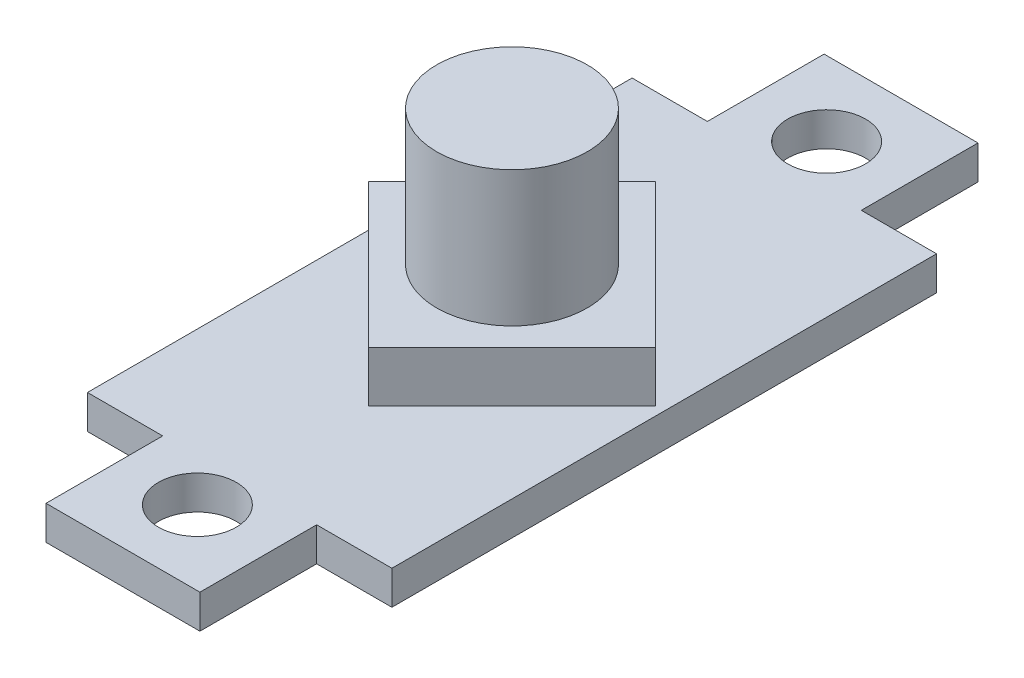
ISO-10303-21;
HEADER;
FILE_DESCRIPTION(('STEP AP214'),'2;1');
FILE_NAME('part.step','',(''),(''),'','','');
FILE_SCHEMA(('AUTOMOTIVE_DESIGN { 1 0 10303 214 1 1 1 1 }'));
ENDSEC;
DATA;
#1=APPLICATION_CONTEXT('core data for automotive mechanical design processes');
#2=APPLICATION_PROTOCOL_DEFINITION('international standard','automotive_design',2000,#1);
#3=PRODUCT_CONTEXT('',#1,'mechanical');
#4=PRODUCT('Part','Part','',(#3));
#5=PRODUCT_RELATED_PRODUCT_CATEGORY('part','',(#4));
#6=PRODUCT_DEFINITION_FORMATION('','',#4);
#7=PRODUCT_DEFINITION_CONTEXT('part definition',#1,'design');
#8=PRODUCT_DEFINITION('design','',#6,#7);
#9=PRODUCT_DEFINITION_SHAPE('','',#8);
#10=(LENGTH_UNIT() NAMED_UNIT(*) SI_UNIT(.MILLI.,.METRE.));
#11=(NAMED_UNIT(*) PLANE_ANGLE_UNIT() SI_UNIT($,.RADIAN.));
#12=(NAMED_UNIT(*) SI_UNIT($,.STERADIAN.) SOLID_ANGLE_UNIT());
#13=UNCERTAINTY_MEASURE_WITH_UNIT(LENGTH_MEASURE(1.E-05),#10,'distance_accuracy_value','');
#14=(GEOMETRIC_REPRESENTATION_CONTEXT(3) GLOBAL_UNCERTAINTY_ASSIGNED_CONTEXT((#13)) GLOBAL_UNIT_ASSIGNED_CONTEXT((#10,
#11,#12)) REPRESENTATION_CONTEXT('',''));
#15=CARTESIAN_POINT('',(0.,0.,0.));
#16=DIRECTION('',(0.,0.,1.));
#17=DIRECTION('',(1.,0.,0.));
#18=AXIS2_PLACEMENT_3D('',#15,#16,#17);
#19=CARTESIAN_POINT('',(0.,2.5,0.));
#20=DIRECTION('',(0.,1.,0.));
#21=DIRECTION('',(0.,0.,1.));
#22=AXIS2_PLACEMENT_3D('',#19,#20,#21);
#23=PLANE('',#22);
#24=DIRECTION('',(0.707106781186548,0.,0.707106781186547));
#25=VECTOR('',#24,1.);
#26=CARTESIAN_POINT('',(-4.24264068711929,2.5,0.));
#27=LINE('',#26,#25);
#28=CARTESIAN_POINT('',(-4.24264068711929,2.5,0.));
#29=VERTEX_POINT('',#28);
#30=CARTESIAN_POINT('',(0.,2.5,4.24264068711929));
#31=VERTEX_POINT('',#30);
#32=EDGE_CURVE('E279',#29,#31,#27,.T.);
#33=ORIENTED_EDGE('',*,*,#32,.T.);
#34=DIRECTION('',(0.707106781186547,0.,-0.707106781186548));
#35=VECTOR('',#34,1.);
#36=CARTESIAN_POINT('',(0.,2.5,4.24264068711929));
#37=LINE('',#36,#35);
#38=CARTESIAN_POINT('',(4.24264068711928,2.5,0.));
#39=VERTEX_POINT('',#38);
#40=EDGE_CURVE('E294',#31,#39,#37,.T.);
#41=ORIENTED_EDGE('',*,*,#40,.T.);
#42=DIRECTION('',(-0.707106781186547,0.,-0.707106781186548));
#43=VECTOR('',#42,1.);
#44=CARTESIAN_POINT('',(4.24264068711928,2.5,0.));
#45=LINE('',#44,#43);
#46=CARTESIAN_POINT('',(0.,2.5,-4.24264068711928));
#47=VERTEX_POINT('',#46);
#48=EDGE_CURVE('E291',#39,#47,#45,.T.);
#49=ORIENTED_EDGE('',*,*,#48,.T.);
#50=DIRECTION('',(-0.707106781186548,0.,0.707106781186547));
#51=VECTOR('',#50,1.);
#52=CARTESIAN_POINT('',(0.,2.5,-4.24264068711928));
#53=LINE('',#52,#51);
#54=EDGE_CURVE('E276',#47,#29,#53,.T.);
#55=ORIENTED_EDGE('',*,*,#54,.T.);
#56=EDGE_LOOP('',(#33,#41,#49,#55));
#57=FACE_BOUND('',#56,.T.);
#58=CARTESIAN_POINT('',(0.,2.5,0.));
#59=DIRECTION('',(0.,1.,0.));
#60=DIRECTION('',(0.,0.,1.));
#61=AXIS2_PLACEMENT_3D('',#58,#59,#60);
#62=CIRCLE('',#61,2.22664019701576);
#63=CARTESIAN_POINT('',(0.,2.5,2.22664019701576));
#64=VERTEX_POINT('',#63);
#65=EDGE_CURVE('E299',#64,#64,#62,.T.);
#66=ORIENTED_EDGE('',*,*,#65,.F.);
#67=EDGE_LOOP('',(#66));
#68=FACE_BOUND('',#67,.T.);
#69=ADVANCED_FACE('F32',(#57,#68),#23,.T.);
#70=CARTESIAN_POINT('',(0.,1.,0.));
#71=DIRECTION('',(0.,1.,0.));
#72=DIRECTION('',(0.,0.,1.));
#73=AXIS2_PLACEMENT_3D('',#70,#71,#72);
#74=PLANE('',#73);
#75=CARTESIAN_POINT('',(0.,1.,9.3));
#76=DIRECTION('',(0.,1.,0.));
#77=DIRECTION('',(0.,0.,1.));
#78=AXIS2_PLACEMENT_3D('',#75,#76,#77);
#79=CIRCLE('',#78,1.15);
#80=CARTESIAN_POINT('',(0.,1.,10.45));
#81=VERTEX_POINT('',#80);
#82=EDGE_CURVE('E166',#81,#81,#79,.F.);
#83=ORIENTED_EDGE('',*,*,#82,.T.);
#84=EDGE_LOOP('',(#83));
#85=FACE_BOUND('',#84,.T.);
#86=CARTESIAN_POINT('',(0.,1.,-9.3));
#87=DIRECTION('',(0.,1.,0.));
#88=DIRECTION('',(0.,0.,1.));
#89=AXIS2_PLACEMENT_3D('',#86,#87,#88);
#90=CIRCLE('',#89,1.15);
#91=CARTESIAN_POINT('',(0.,1.,-8.15));
#92=VERTEX_POINT('',#91);
#93=EDGE_CURVE('E160',#92,#92,#90,.T.);
#94=ORIENTED_EDGE('',*,*,#93,.F.);
#95=EDGE_LOOP('',(#94));
#96=FACE_BOUND('',#95,.T.);
#97=DIRECTION('',(-1.,0.,0.));
#98=VECTOR('',#97,1.);
#99=CARTESIAN_POINT('',(0.,1.,8.05));
#100=LINE('',#99,#98);
#101=CARTESIAN_POINT('',(-2.275,1.,8.05));
#102=VERTEX_POINT('',#101);
#103=CARTESIAN_POINT('',(-4.5,1.,8.05));
#104=VERTEX_POINT('',#103);
#105=EDGE_CURVE('E207',#102,#104,#100,.T.);
#106=ORIENTED_EDGE('',*,*,#105,.F.);
#107=DIRECTION('',(0.,0.,1.));
#108=VECTOR('',#107,1.);
#109=CARTESIAN_POINT('',(-2.275,1.,0.));
#110=LINE('',#109,#108);
#111=CARTESIAN_POINT('',(-2.275,1.,11.5));
#112=VERTEX_POINT('',#111);
#113=EDGE_CURVE('E248',#102,#112,#110,.T.);
#114=ORIENTED_EDGE('',*,*,#113,.T.);
#115=DIRECTION('',(1.,0.,0.));
#116=VECTOR('',#115,1.);
#117=CARTESIAN_POINT('',(0.,1.,11.5));
#118=LINE('',#117,#116);
#119=CARTESIAN_POINT('',(2.275,1.,11.5));
#120=VERTEX_POINT('',#119);
#121=EDGE_CURVE('E229',#112,#120,#118,.T.);
#122=ORIENTED_EDGE('',*,*,#121,.T.);
#123=DIRECTION('',(0.,0.,1.));
#124=VECTOR('',#123,1.);
#125=CARTESIAN_POINT('',(2.275,1.,0.));
#126=LINE('',#125,#124);
#127=CARTESIAN_POINT('',(2.275,1.,8.05));
#128=VERTEX_POINT('',#127);
#129=EDGE_CURVE('E241',#128,#120,#126,.T.);
#130=ORIENTED_EDGE('',*,*,#129,.F.);
#131=DIRECTION('',(-1.,0.,0.));
#132=VECTOR('',#131,1.);
#133=CARTESIAN_POINT('',(0.,1.,8.05));
#134=LINE('',#133,#132);
#135=CARTESIAN_POINT('',(4.5,1.,8.05));
#136=VERTEX_POINT('',#135);
#137=EDGE_CURVE('E244',#136,#128,#134,.T.);
#138=ORIENTED_EDGE('',*,*,#137,.F.);
#139=DIRECTION('',(0.,0.,1.));
#140=VECTOR('',#139,1.);
#141=CARTESIAN_POINT('',(4.5,1.,0.));
#142=LINE('',#141,#140);
#143=CARTESIAN_POINT('',(4.5,1.,-8.05));
#144=VERTEX_POINT('',#143);
#145=EDGE_CURVE('E246',#144,#136,#142,.T.);
#146=ORIENTED_EDGE('',*,*,#145,.F.);
#147=DIRECTION('',(-1.,0.,0.));
#148=VECTOR('',#147,1.);
#149=CARTESIAN_POINT('',(0.,1.,-8.05));
#150=LINE('',#149,#148);
#151=CARTESIAN_POINT('',(2.275,1.,-8.05));
#152=VERTEX_POINT('',#151);
#153=EDGE_CURVE('E254',#144,#152,#150,.T.);
#154=ORIENTED_EDGE('',*,*,#153,.T.);
#155=DIRECTION('',(0.,0.,1.));
#156=VECTOR('',#155,1.);
#157=CARTESIAN_POINT('',(2.275,1.,0.));
#158=LINE('',#157,#156);
#159=CARTESIAN_POINT('',(2.275,1.,-11.5));
#160=VERTEX_POINT('',#159);
#161=EDGE_CURVE('E256',#160,#152,#158,.T.);
#162=ORIENTED_EDGE('',*,*,#161,.F.);
#163=DIRECTION('',(1.,0.,0.));
#164=VECTOR('',#163,1.);
#165=CARTESIAN_POINT('',(0.,1.,-11.5));
#166=LINE('',#165,#164);
#167=CARTESIAN_POINT('',(-2.275,1.,-11.5));
#168=VERTEX_POINT('',#167);
#169=EDGE_CURVE('E144',#168,#160,#166,.T.);
#170=ORIENTED_EDGE('',*,*,#169,.F.);
#171=DIRECTION('',(0.,0.,1.));
#172=VECTOR('',#171,1.);
#173=CARTESIAN_POINT('',(-2.275,1.,0.));
#174=LINE('',#173,#172);
#175=CARTESIAN_POINT('',(-2.275,1.,-8.05));
#176=VERTEX_POINT('',#175);
#177=EDGE_CURVE('E135',#168,#176,#174,.T.);
#178=ORIENTED_EDGE('',*,*,#177,.T.);
#179=DIRECTION('',(-1.,0.,0.));
#180=VECTOR('',#179,1.);
#181=CARTESIAN_POINT('',(0.,1.,-8.05));
#182=LINE('',#181,#180);
#183=CARTESIAN_POINT('',(-4.5,1.,-8.05));
#184=VERTEX_POINT('',#183);
#185=EDGE_CURVE('E140',#176,#184,#182,.T.);
#186=ORIENTED_EDGE('',*,*,#185,.T.);
#187=DIRECTION('',(0.,0.,1.));
#188=VECTOR('',#187,1.);
#189=CARTESIAN_POINT('',(-4.5,1.,0.));
#190=LINE('',#189,#188);
#191=EDGE_CURVE('E56',#184,#104,#190,.T.);
#192=ORIENTED_EDGE('',*,*,#191,.T.);
#193=EDGE_LOOP('',(#106,#114,#122,#130,#138,#146,#154,#162,#170,#178,#186,#192));
#194=FACE_BOUND('',#193,.T.);
#195=DIRECTION('',(0.707106781186547,0.,-0.707106781186548));
#196=VECTOR('',#195,1.);
#197=CARTESIAN_POINT('',(0.,1.,4.24264068711929));
#198=LINE('',#197,#196);
#199=CARTESIAN_POINT('',(0.,1.,4.24264068711929));
#200=VERTEX_POINT('',#199);
#201=CARTESIAN_POINT('',(4.24264068711928,1.,0.));
#202=VERTEX_POINT('',#201);
#203=EDGE_CURVE('E282',#200,#202,#198,.T.);
#204=ORIENTED_EDGE('',*,*,#203,.F.);
#205=DIRECTION('',(0.707106781186548,0.,0.707106781186547));
#206=VECTOR('',#205,1.);
#207=CARTESIAN_POINT('',(-4.24264068711929,1.,0.));
#208=LINE('',#207,#206);
#209=CARTESIAN_POINT('',(-4.24264068711929,1.,0.));
#210=VERTEX_POINT('',#209);
#211=EDGE_CURVE('E285',#210,#200,#208,.T.);
#212=ORIENTED_EDGE('',*,*,#211,.F.);
#213=DIRECTION('',(-0.707106781186548,0.,0.707106781186547));
#214=VECTOR('',#213,1.);
#215=CARTESIAN_POINT('',(0.,1.,-4.24264068711928));
#216=LINE('',#215,#214);
#217=CARTESIAN_POINT('',(0.,1.,-4.24264068711928));
#218=VERTEX_POINT('',#217);
#219=EDGE_CURVE('E277',#218,#210,#216,.T.);
#220=ORIENTED_EDGE('',*,*,#219,.F.);
#221=DIRECTION('',(-0.707106781186547,0.,-0.707106781186548));
#222=VECTOR('',#221,1.);
#223=CARTESIAN_POINT('',(4.24264068711928,1.,0.));
#224=LINE('',#223,#222);
#225=EDGE_CURVE('E280',#202,#218,#224,.T.);
#226=ORIENTED_EDGE('',*,*,#225,.F.);
#227=EDGE_LOOP('',(#204,#212,#220,#226));
#228=FACE_BOUND('',#227,.T.);
#229=ADVANCED_FACE('F137',(#85,#96,#194,#228),#74,.T.);
#230=CARTESIAN_POINT('',(0.,1.,8.05));
#231=DIRECTION('',(0.,0.,1.));
#232=DIRECTION('',(1.,0.,0.));
#233=AXIS2_PLACEMENT_3D('',#230,#231,#232);
#234=PLANE('',#233);
#235=DIRECTION('',(-1.,0.,0.));
#236=VECTOR('',#235,1.);
#237=CARTESIAN_POINT('',(0.,0.,8.05));
#238=LINE('',#237,#236);
#239=CARTESIAN_POINT('',(-2.275,0.,8.05));
#240=VERTEX_POINT('',#239);
#241=CARTESIAN_POINT('',(-4.5,0.,8.05));
#242=VERTEX_POINT('',#241);
#243=EDGE_CURVE('E169',#240,#242,#238,.T.);
#244=ORIENTED_EDGE('',*,*,#243,.F.);
#245=DIRECTION('',(0.,-1.,0.));
#246=VECTOR('',#245,1.);
#247=CARTESIAN_POINT('',(-2.275,1.,8.05));
#248=LINE('',#247,#246);
#249=EDGE_CURVE('E11',#102,#240,#248,.T.);
#250=ORIENTED_EDGE('',*,*,#249,.F.);
#251=ORIENTED_EDGE('',*,*,#105,.T.);
#252=DIRECTION('',(0.,-1.,0.));
#253=VECTOR('',#252,1.);
#254=CARTESIAN_POINT('',(-4.5,1.,8.05));
#255=LINE('',#254,#253);
#256=EDGE_CURVE('E100',#104,#242,#255,.T.);
#257=ORIENTED_EDGE('',*,*,#256,.T.);
#258=EDGE_LOOP('',(#244,#250,#251,#257));
#259=FACE_BOUND('',#258,.T.);
#260=ADVANCED_FACE('F34',(#259),#234,.T.);
#261=CARTESIAN_POINT('',(-2.275,1.,0.));
#262=DIRECTION('',(1.,0.,0.));
#263=DIRECTION('',(0.,0.,-1.));
#264=AXIS2_PLACEMENT_3D('',#261,#262,#263);
#265=PLANE('',#264);
#266=DIRECTION('',(0.,0.,1.));
#267=VECTOR('',#266,1.);
#268=CARTESIAN_POINT('',(-2.275,0.,0.));
#269=LINE('',#268,#267);
#270=CARTESIAN_POINT('',(-2.275,0.,11.5));
#271=VERTEX_POINT('',#270);
#272=EDGE_CURVE('E172',#240,#271,#269,.T.);
#273=ORIENTED_EDGE('',*,*,#272,.T.);
#274=DIRECTION('',(0.,-1.,0.));
#275=VECTOR('',#274,1.);
#276=CARTESIAN_POINT('',(-2.275,1.,11.5));
#277=LINE('',#276,#275);
#278=EDGE_CURVE('E40',#112,#271,#277,.T.);
#279=ORIENTED_EDGE('',*,*,#278,.F.);
#280=ORIENTED_EDGE('',*,*,#113,.F.);
#281=ORIENTED_EDGE('',*,*,#249,.T.);
#282=EDGE_LOOP('',(#273,#279,#280,#281));
#283=FACE_BOUND('',#282,.T.);
#284=ADVANCED_FACE('F375',(#283),#265,.F.);
#285=CARTESIAN_POINT('',(0.,1.,11.5));
#286=DIRECTION('',(0.,0.,-1.));
#287=DIRECTION('',(-1.,0.,0.));
#288=AXIS2_PLACEMENT_3D('',#285,#286,#287);
#289=PLANE('',#288);
#290=DIRECTION('',(1.,0.,0.));
#291=VECTOR('',#290,1.);
#292=CARTESIAN_POINT('',(0.,0.,11.5));
#293=LINE('',#292,#291);
#294=CARTESIAN_POINT('',(2.275,0.,11.5));
#295=VERTEX_POINT('',#294);
#296=EDGE_CURVE('E175',#271,#295,#293,.T.);
#297=ORIENTED_EDGE('',*,*,#296,.T.);
#298=DIRECTION('',(0.,-1.,0.));
#299=VECTOR('',#298,1.);
#300=CARTESIAN_POINT('',(2.275,1.,11.5));
#301=LINE('',#300,#299);
#302=EDGE_CURVE('E221',#120,#295,#301,.T.);
#303=ORIENTED_EDGE('',*,*,#302,.F.);
#304=ORIENTED_EDGE('',*,*,#121,.F.);
#305=ORIENTED_EDGE('',*,*,#278,.T.);
#306=EDGE_LOOP('',(#297,#303,#304,#305));
#307=FACE_BOUND('',#306,.T.);
#308=ADVANCED_FACE('F227',(#307),#289,.F.);
#309=CARTESIAN_POINT('',(2.275,1.,0.));
#310=DIRECTION('',(1.,0.,0.));
#311=DIRECTION('',(0.,0.,-1.));
#312=AXIS2_PLACEMENT_3D('',#309,#310,#311);
#313=PLANE('',#312);
#314=DIRECTION('',(0.,0.,1.));
#315=VECTOR('',#314,1.);
#316=CARTESIAN_POINT('',(2.275,0.,0.));
#317=LINE('',#316,#315);
#318=CARTESIAN_POINT('',(2.275,0.,8.05));
#319=VERTEX_POINT('',#318);
#320=EDGE_CURVE('E178',#319,#295,#317,.T.);
#321=ORIENTED_EDGE('',*,*,#320,.F.);
#322=DIRECTION('',(0.,-1.,0.));
#323=VECTOR('',#322,1.);
#324=CARTESIAN_POINT('',(2.275,1.,8.05));
#325=LINE('',#324,#323);
#326=EDGE_CURVE('E219',#128,#319,#325,.T.);
#327=ORIENTED_EDGE('',*,*,#326,.F.);
#328=ORIENTED_EDGE('',*,*,#129,.T.);
#329=ORIENTED_EDGE('',*,*,#302,.T.);
#330=EDGE_LOOP('',(#321,#327,#328,#329));
#331=FACE_BOUND('',#330,.T.);
#332=ADVANCED_FACE('F238',(#331),#313,.T.);
#333=CARTESIAN_POINT('',(0.,1.,8.05));
#334=DIRECTION('',(0.,0.,1.));
#335=DIRECTION('',(1.,0.,0.));
#336=AXIS2_PLACEMENT_3D('',#333,#334,#335);
#337=PLANE('',#336);
#338=DIRECTION('',(-1.,0.,0.));
#339=VECTOR('',#338,1.);
#340=CARTESIAN_POINT('',(0.,0.,8.05));
#341=LINE('',#340,#339);
#342=CARTESIAN_POINT('',(4.5,0.,8.05));
#343=VERTEX_POINT('',#342);
#344=EDGE_CURVE('E181',#343,#319,#341,.T.);
#345=ORIENTED_EDGE('',*,*,#344,.F.);
#346=DIRECTION('',(0.,-1.,0.));
#347=VECTOR('',#346,1.);
#348=CARTESIAN_POINT('',(4.5,1.,8.05));
#349=LINE('',#348,#347);
#350=EDGE_CURVE('E217',#136,#343,#349,.T.);
#351=ORIENTED_EDGE('',*,*,#350,.F.);
#352=ORIENTED_EDGE('',*,*,#137,.T.);
#353=ORIENTED_EDGE('',*,*,#326,.T.);
#354=EDGE_LOOP('',(#345,#351,#352,#353));
#355=FACE_BOUND('',#354,.T.);
#356=ADVANCED_FACE('F367',(#355),#337,.T.);
#357=CARTESIAN_POINT('',(4.5,1.,0.));
#358=DIRECTION('',(1.,0.,0.));
#359=DIRECTION('',(0.,0.,-1.));
#360=AXIS2_PLACEMENT_3D('',#357,#358,#359);
#361=PLANE('',#360);
#362=DIRECTION('',(0.,0.,1.));
#363=VECTOR('',#362,1.);
#364=CARTESIAN_POINT('',(4.5,0.,0.));
#365=LINE('',#364,#363);
#366=CARTESIAN_POINT('',(4.5,0.,-8.05));
#367=VERTEX_POINT('',#366);
#368=EDGE_CURVE('E184',#367,#343,#365,.T.);
#369=ORIENTED_EDGE('',*,*,#368,.F.);
#370=DIRECTION('',(0.,-1.,0.));
#371=VECTOR('',#370,1.);
#372=CARTESIAN_POINT('',(4.5,1.,-8.05));
#373=LINE('',#372,#371);
#374=EDGE_CURVE('E215',#144,#367,#373,.T.);
#375=ORIENTED_EDGE('',*,*,#374,.F.);
#376=ORIENTED_EDGE('',*,*,#145,.T.);
#377=ORIENTED_EDGE('',*,*,#350,.T.);
#378=EDGE_LOOP('',(#369,#375,#376,#377));
#379=FACE_BOUND('',#378,.T.);
#380=ADVANCED_FACE('F363',(#379),#361,.T.);
#381=CARTESIAN_POINT('',(0.,1.,-8.05));
#382=DIRECTION('',(0.,0.,1.));
#383=DIRECTION('',(1.,0.,0.));
#384=AXIS2_PLACEMENT_3D('',#381,#382,#383);
#385=PLANE('',#384);
#386=DIRECTION('',(-1.,0.,0.));
#387=VECTOR('',#386,1.);
#388=CARTESIAN_POINT('',(0.,0.,-8.05));
#389=LINE('',#388,#387);
#390=CARTESIAN_POINT('',(2.275,0.,-8.05));
#391=VERTEX_POINT('',#390);
#392=EDGE_CURVE('E187',#367,#391,#389,.T.);
#393=ORIENTED_EDGE('',*,*,#392,.T.);
#394=DIRECTION('',(0.,-1.,0.));
#395=VECTOR('',#394,1.);
#396=CARTESIAN_POINT('',(2.275,1.,-8.05));
#397=LINE('',#396,#395);
#398=EDGE_CURVE('E213',#152,#391,#397,.T.);
#399=ORIENTED_EDGE('',*,*,#398,.F.);
#400=ORIENTED_EDGE('',*,*,#153,.F.);
#401=ORIENTED_EDGE('',*,*,#374,.T.);
#402=EDGE_LOOP('',(#393,#399,#400,#401));
#403=FACE_BOUND('',#402,.T.);
#404=ADVANCED_FACE('F359',(#403),#385,.F.);
#405=CARTESIAN_POINT('',(2.275,1.,0.));
#406=DIRECTION('',(1.,0.,0.));
#407=DIRECTION('',(0.,0.,-1.));
#408=AXIS2_PLACEMENT_3D('',#405,#406,#407);
#409=PLANE('',#408);
#410=DIRECTION('',(0.,0.,1.));
#411=VECTOR('',#410,1.);
#412=CARTESIAN_POINT('',(2.275,0.,0.));
#413=LINE('',#412,#411);
#414=CARTESIAN_POINT('',(2.275,0.,-11.5));
#415=VERTEX_POINT('',#414);
#416=EDGE_CURVE('E190',#415,#391,#413,.T.);
#417=ORIENTED_EDGE('',*,*,#416,.F.);
#418=DIRECTION('',(0.,-1.,0.));
#419=VECTOR('',#418,1.);
#420=CARTESIAN_POINT('',(2.275,1.,-11.5));
#421=LINE('',#420,#419);
#422=EDGE_CURVE('E211',#160,#415,#421,.T.);
#423=ORIENTED_EDGE('',*,*,#422,.F.);
#424=ORIENTED_EDGE('',*,*,#161,.T.);
#425=ORIENTED_EDGE('',*,*,#398,.T.);
#426=EDGE_LOOP('',(#417,#423,#424,#425));
#427=FACE_BOUND('',#426,.T.);
#428=ADVANCED_FACE('F356',(#427),#409,.T.);
#429=CARTESIAN_POINT('',(0.,1.,-11.5));
#430=DIRECTION('',(0.,0.,-1.));
#431=DIRECTION('',(-1.,0.,0.));
#432=AXIS2_PLACEMENT_3D('',#429,#430,#431);
#433=PLANE('',#432);
#434=DIRECTION('',(1.,0.,0.));
#435=VECTOR('',#434,1.);
#436=CARTESIAN_POINT('',(0.,0.,-11.5));
#437=LINE('',#436,#435);
#438=CARTESIAN_POINT('',(-2.275,0.,-11.5));
#439=VERTEX_POINT('',#438);
#440=EDGE_CURVE('E193',#439,#415,#437,.T.);
#441=ORIENTED_EDGE('',*,*,#440,.F.);
#442=DIRECTION('',(0.,-1.,0.));
#443=VECTOR('',#442,1.);
#444=CARTESIAN_POINT('',(-2.275,1.,-11.5));
#445=LINE('',#444,#443);
#446=EDGE_CURVE('E154',#168,#439,#445,.T.);
#447=ORIENTED_EDGE('',*,*,#446,.F.);
#448=ORIENTED_EDGE('',*,*,#169,.T.);
#449=ORIENTED_EDGE('',*,*,#422,.T.);
#450=EDGE_LOOP('',(#441,#447,#448,#449));
#451=FACE_BOUND('',#450,.T.);
#452=ADVANCED_FACE('F260',(#451),#433,.T.);
#453=CARTESIAN_POINT('',(-2.275,1.,0.));
#454=DIRECTION('',(1.,0.,0.));
#455=DIRECTION('',(0.,0.,-1.));
#456=AXIS2_PLACEMENT_3D('',#453,#454,#455);
#457=PLANE('',#456);
#458=DIRECTION('',(0.,0.,1.));
#459=VECTOR('',#458,1.);
#460=CARTESIAN_POINT('',(-2.275,0.,0.));
#461=LINE('',#460,#459);
#462=CARTESIAN_POINT('',(-2.275,0.,-8.05));
#463=VERTEX_POINT('',#462);
#464=EDGE_CURVE('E151',#439,#463,#461,.T.);
#465=ORIENTED_EDGE('',*,*,#464,.T.);
#466=DIRECTION('',(0.,-1.,0.));
#467=VECTOR('',#466,1.);
#468=CARTESIAN_POINT('',(-2.275,1.,-8.05));
#469=LINE('',#468,#467);
#470=EDGE_CURVE('E148',#176,#463,#469,.T.);
#471=ORIENTED_EDGE('',*,*,#470,.F.);
#472=ORIENTED_EDGE('',*,*,#177,.F.);
#473=ORIENTED_EDGE('',*,*,#446,.T.);
#474=EDGE_LOOP('',(#465,#471,#472,#473));
#475=FACE_BOUND('',#474,.T.);
#476=ADVANCED_FACE('F149',(#475),#457,.F.);
#477=CARTESIAN_POINT('',(0.,1.,-8.05));
#478=DIRECTION('',(0.,0.,1.));
#479=DIRECTION('',(1.,0.,0.));
#480=AXIS2_PLACEMENT_3D('',#477,#478,#479);
#481=PLANE('',#480);
#482=DIRECTION('',(-1.,0.,0.));
#483=VECTOR('',#482,1.);
#484=CARTESIAN_POINT('',(0.,0.,-8.05));
#485=LINE('',#484,#483);
#486=CARTESIAN_POINT('',(-4.5,0.,-8.05));
#487=VERTEX_POINT('',#486);
#488=EDGE_CURVE('E197',#463,#487,#485,.T.);
#489=ORIENTED_EDGE('',*,*,#488,.T.);
#490=DIRECTION('',(0.,-1.,0.));
#491=VECTOR('',#490,1.);
#492=CARTESIAN_POINT('',(-4.5,1.,-8.05));
#493=LINE('',#492,#491);
#494=EDGE_CURVE('E155',#184,#487,#493,.T.);
#495=ORIENTED_EDGE('',*,*,#494,.F.);
#496=ORIENTED_EDGE('',*,*,#185,.F.);
#497=ORIENTED_EDGE('',*,*,#470,.T.);
#498=EDGE_LOOP('',(#489,#495,#496,#497));
#499=FACE_BOUND('',#498,.T.);
#500=ADVANCED_FACE('F157',(#499),#481,.F.);
#501=CARTESIAN_POINT('',(0.,1.,-9.3));
#502=DIRECTION('',(0.,-1.,0.));
#503=DIRECTION('',(0.,0.,-1.));
#504=AXIS2_PLACEMENT_3D('',#501,#502,#503);
#505=CYLINDRICAL_SURFACE('',#504,1.15);
#506=ORIENTED_EDGE('',*,*,#93,.T.);
#507=EDGE_LOOP('',(#506));
#508=FACE_BOUND('',#507,.T.);
#509=CARTESIAN_POINT('',(0.,0.,-9.3));
#510=DIRECTION('',(0.,1.,0.));
#511=DIRECTION('',(0.,0.,1.));
#512=AXIS2_PLACEMENT_3D('',#509,#510,#511);
#513=CIRCLE('',#512,1.15);
#514=CARTESIAN_POINT('',(0.,0.,-8.15));
#515=VERTEX_POINT('',#514);
#516=EDGE_CURVE('E201',#515,#515,#513,.T.);
#517=ORIENTED_EDGE('',*,*,#516,.F.);
#518=EDGE_LOOP('',(#517));
#519=FACE_BOUND('',#518,.T.);
#520=ADVANCED_FACE('F344',(#508,#519),#505,.F.);
#521=CARTESIAN_POINT('',(-4.5,1.,0.));
#522=DIRECTION('',(1.,0.,0.));
#523=DIRECTION('',(0.,0.,-1.));
#524=AXIS2_PLACEMENT_3D('',#521,#522,#523);
#525=PLANE('',#524);
#526=DIRECTION('',(0.,0.,1.));
#527=VECTOR('',#526,1.);
#528=CARTESIAN_POINT('',(-4.5,0.,0.));
#529=LINE('',#528,#527);
#530=EDGE_CURVE('E199',#487,#242,#529,.T.);
#531=ORIENTED_EDGE('',*,*,#530,.T.);
#532=ORIENTED_EDGE('',*,*,#256,.F.);
#533=ORIENTED_EDGE('',*,*,#191,.F.);
#534=ORIENTED_EDGE('',*,*,#494,.T.);
#535=EDGE_LOOP('',(#531,#532,#533,#534));
#536=FACE_BOUND('',#535,.T.);
#537=ADVANCED_FACE('F264',(#536),#525,.F.);
#538=CARTESIAN_POINT('',(0.,1.,9.3));
#539=DIRECTION('',(0.,-1.,0.));
#540=DIRECTION('',(0.,0.,-1.));
#541=AXIS2_PLACEMENT_3D('',#538,#539,#540);
#542=CYLINDRICAL_SURFACE('',#541,1.15);
#543=ORIENTED_EDGE('',*,*,#82,.F.);
#544=EDGE_LOOP('',(#543));
#545=FACE_BOUND('',#544,.T.);
#546=CARTESIAN_POINT('',(0.,0.,9.3));
#547=DIRECTION('',(0.,1.,0.));
#548=DIRECTION('',(0.,0.,1.));
#549=AXIS2_PLACEMENT_3D('',#546,#547,#548);
#550=CIRCLE('',#549,1.15);
#551=CARTESIAN_POINT('',(0.,0.,10.45));
#552=VERTEX_POINT('',#551);
#553=EDGE_CURVE('E204',#552,#552,#550,.F.);
#554=ORIENTED_EDGE('',*,*,#553,.T.);
#555=EDGE_LOOP('',(#554));
#556=FACE_BOUND('',#555,.T.);
#557=ADVANCED_FACE('F340',(#545,#556),#542,.F.);
#558=CARTESIAN_POINT('',(0.,0.,0.));
#559=DIRECTION('',(0.,1.,0.));
#560=DIRECTION('',(0.,0.,1.));
#561=AXIS2_PLACEMENT_3D('',#558,#559,#560);
#562=PLANE('',#561);
#563=ORIENTED_EDGE('',*,*,#243,.T.);
#564=ORIENTED_EDGE('',*,*,#530,.F.);
#565=ORIENTED_EDGE('',*,*,#488,.F.);
#566=ORIENTED_EDGE('',*,*,#464,.F.);
#567=ORIENTED_EDGE('',*,*,#440,.T.);
#568=ORIENTED_EDGE('',*,*,#416,.T.);
#569=ORIENTED_EDGE('',*,*,#392,.F.);
#570=ORIENTED_EDGE('',*,*,#368,.T.);
#571=ORIENTED_EDGE('',*,*,#344,.T.);
#572=ORIENTED_EDGE('',*,*,#320,.T.);
#573=ORIENTED_EDGE('',*,*,#296,.F.);
#574=ORIENTED_EDGE('',*,*,#272,.F.);
#575=EDGE_LOOP('',(#563,#564,#565,#566,#567,#568,#569,#570,#571,#572,#573,#574));
#576=FACE_BOUND('',#575,.T.);
#577=ORIENTED_EDGE('',*,*,#516,.T.);
#578=EDGE_LOOP('',(#577));
#579=FACE_BOUND('',#578,.T.);
#580=ORIENTED_EDGE('',*,*,#553,.F.);
#581=EDGE_LOOP('',(#580));
#582=FACE_BOUND('',#581,.T.);
#583=ADVANCED_FACE('F233',(#576,#579,#582),#562,.F.);
#584=CARTESIAN_POINT('',(-4.24264068711929,2.5,0.));
#585=DIRECTION('',(0.707106781186547,0.,-0.707106781186548));
#586=DIRECTION('',(-0.707106781186548,0.,-0.707106781186547));
#587=AXIS2_PLACEMENT_3D('',#584,#585,#586);
#588=PLANE('',#587);
#589=ORIENTED_EDGE('',*,*,#211,.T.);
#590=DIRECTION('',(0.,-1.,0.));
#591=VECTOR('',#590,1.);
#592=CARTESIAN_POINT('',(0.,2.5,4.24264068711929));
#593=LINE('',#592,#591);
#594=EDGE_CURVE('E173',#31,#200,#593,.T.);
#595=ORIENTED_EDGE('',*,*,#594,.F.);
#596=ORIENTED_EDGE('',*,*,#32,.F.);
#597=DIRECTION('',(0.,-1.,0.));
#598=VECTOR('',#597,1.);
#599=CARTESIAN_POINT('',(-4.24264068711929,2.5,0.));
#600=LINE('',#599,#598);
#601=EDGE_CURVE('E273',#29,#210,#600,.T.);
#602=ORIENTED_EDGE('',*,*,#601,.T.);
#603=EDGE_LOOP('',(#589,#595,#596,#602));
#604=FACE_BOUND('',#603,.T.);
#605=ADVANCED_FACE('F333',(#604),#588,.F.);
#606=CARTESIAN_POINT('',(0.,2.5,4.24264068711929));
#607=DIRECTION('',(-0.707106781186548,0.,-0.707106781186547));
#608=DIRECTION('',(-0.707106781186547,0.,0.707106781186548));
#609=AXIS2_PLACEMENT_3D('',#606,#607,#608);
#610=PLANE('',#609);
#611=ORIENTED_EDGE('',*,*,#203,.T.);
#612=DIRECTION('',(0.,-1.,0.));
#613=VECTOR('',#612,1.);
#614=CARTESIAN_POINT('',(4.24264068711928,2.5,0.));
#615=LINE('',#614,#613);
#616=EDGE_CURVE('E269',#39,#202,#615,.T.);
#617=ORIENTED_EDGE('',*,*,#616,.F.);
#618=ORIENTED_EDGE('',*,*,#40,.F.);
#619=ORIENTED_EDGE('',*,*,#594,.T.);
#620=EDGE_LOOP('',(#611,#617,#618,#619));
#621=FACE_BOUND('',#620,.T.);
#622=ADVANCED_FACE('F329',(#621),#610,.F.);
#623=CARTESIAN_POINT('',(4.24264068711928,2.5,0.));
#624=DIRECTION('',(-0.707106781186548,0.,0.707106781186547));
#625=DIRECTION('',(0.707106781186547,0.,0.707106781186548));
#626=AXIS2_PLACEMENT_3D('',#623,#624,#625);
#627=PLANE('',#626);
#628=ORIENTED_EDGE('',*,*,#225,.T.);
#629=DIRECTION('',(0.,-1.,0.));
#630=VECTOR('',#629,1.);
#631=CARTESIAN_POINT('',(0.,2.5,-4.24264068711928));
#632=LINE('',#631,#630);
#633=EDGE_CURVE('E47',#47,#218,#632,.T.);
#634=ORIENTED_EDGE('',*,*,#633,.F.);
#635=ORIENTED_EDGE('',*,*,#48,.F.);
#636=ORIENTED_EDGE('',*,*,#616,.T.);
#637=EDGE_LOOP('',(#628,#634,#635,#636));
#638=FACE_BOUND('',#637,.T.);
#639=ADVANCED_FACE('F326',(#638),#627,.F.);
#640=CARTESIAN_POINT('',(0.,2.5,-4.24264068711928));
#641=DIRECTION('',(0.707106781186547,0.,0.707106781186548));
#642=DIRECTION('',(0.707106781186548,0.,-0.707106781186547));
#643=AXIS2_PLACEMENT_3D('',#640,#641,#642);
#644=PLANE('',#643);
#645=ORIENTED_EDGE('',*,*,#219,.T.);
#646=ORIENTED_EDGE('',*,*,#601,.F.);
#647=ORIENTED_EDGE('',*,*,#54,.F.);
#648=ORIENTED_EDGE('',*,*,#633,.T.);
#649=EDGE_LOOP('',(#645,#646,#647,#648));
#650=FACE_BOUND('',#649,.T.);
#651=ADVANCED_FACE('F310',(#650),#644,.F.);
#652=CARTESIAN_POINT('',(0.,6.5,0.));
#653=DIRECTION('',(0.,-1.,0.));
#654=DIRECTION('',(0.,0.,-1.));
#655=AXIS2_PLACEMENT_3D('',#652,#653,#654);
#656=CYLINDRICAL_SURFACE('',#655,2.22664019701576);
#657=CARTESIAN_POINT('',(0.,6.5,0.));
#658=DIRECTION('',(0.,1.,0.));
#659=DIRECTION('',(0.,0.,1.));
#660=AXIS2_PLACEMENT_3D('',#657,#658,#659);
#661=CIRCLE('',#660,2.22664019701576);
#662=CARTESIAN_POINT('',(0.,6.5,2.22664019701576));
#663=VERTEX_POINT('',#662);
#664=EDGE_CURVE('E288',#663,#663,#661,.T.);
#665=ORIENTED_EDGE('',*,*,#664,.F.);
#666=EDGE_LOOP('',(#665));
#667=FACE_BOUND('',#666,.T.);
#668=ORIENTED_EDGE('',*,*,#65,.T.);
#669=EDGE_LOOP('',(#668));
#670=FACE_BOUND('',#669,.T.);
#671=ADVANCED_FACE('F307',(#667,#670),#656,.T.);
#672=CARTESIAN_POINT('',(0.,6.5,0.));
#673=DIRECTION('',(0.,1.,0.));
#674=DIRECTION('',(0.,0.,1.));
#675=AXIS2_PLACEMENT_3D('',#672,#673,#674);
#676=PLANE('',#675);
#677=ORIENTED_EDGE('',*,*,#664,.T.);
#678=EDGE_LOOP('',(#677));
#679=FACE_BOUND('',#678,.T.);
#680=ADVANCED_FACE('F305',(#679),#676,.T.);
#681=CLOSED_SHELL('',(#69,#229,#260,#284,#308,#332,#356,#380,#404,#428,#452,#476,#500,#520,#537,
#557,#583,#605,#622,#639,#651,#671,#680));
#682=MANIFOLD_SOLID_BREP('B2',#681);
#683=ADVANCED_BREP_SHAPE_REPRESENTATION('',(#18,#682),#14);
#684=SHAPE_DEFINITION_REPRESENTATION(#9,#683);
ENDSEC;
END-ISO-10303-21;
